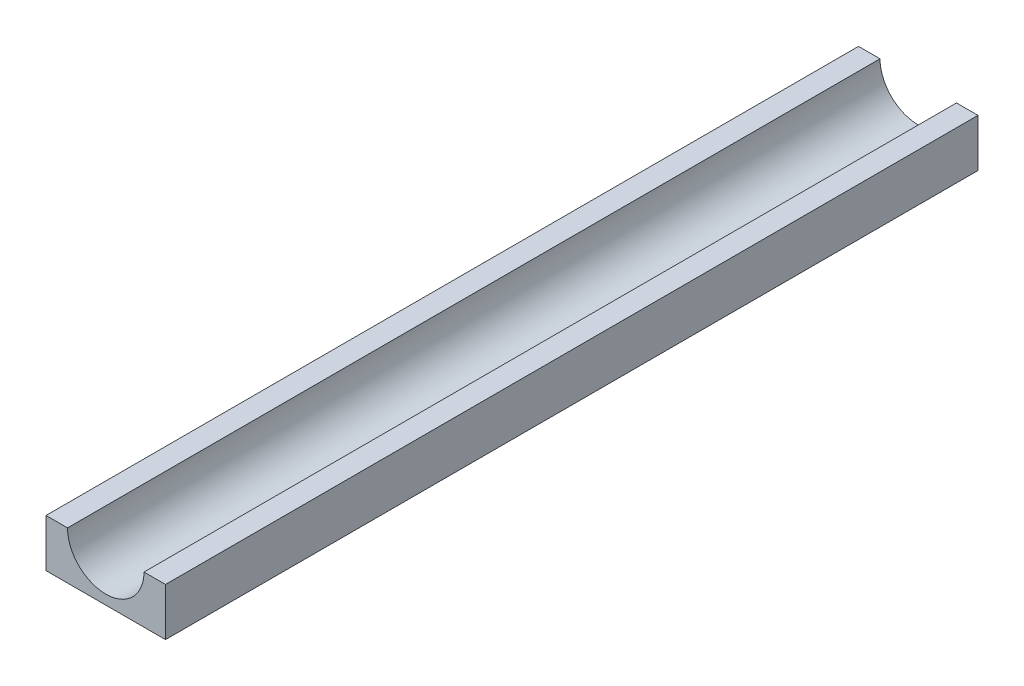
ISO-10303-21;
HEADER;
FILE_DESCRIPTION(('STEP AP214'),'2;1');
FILE_NAME('part.step','',(''),(''),'','','');
FILE_SCHEMA(('AUTOMOTIVE_DESIGN { 1 0 10303 214 1 1 1 1 }'));
ENDSEC;
DATA;
#1=APPLICATION_CONTEXT('core data for automotive mechanical design processes');
#2=APPLICATION_PROTOCOL_DEFINITION('international standard','automotive_design',2000,#1);
#3=PRODUCT_CONTEXT('',#1,'mechanical');
#4=PRODUCT('Part','Part','',(#3));
#5=PRODUCT_RELATED_PRODUCT_CATEGORY('part','',(#4));
#6=PRODUCT_DEFINITION_FORMATION('','',#4);
#7=PRODUCT_DEFINITION_CONTEXT('part definition',#1,'design');
#8=PRODUCT_DEFINITION('design','',#6,#7);
#9=PRODUCT_DEFINITION_SHAPE('','',#8);
#10=(LENGTH_UNIT() NAMED_UNIT(*) SI_UNIT(.MILLI.,.METRE.));
#11=(NAMED_UNIT(*) PLANE_ANGLE_UNIT() SI_UNIT($,.RADIAN.));
#12=(NAMED_UNIT(*) SI_UNIT($,.STERADIAN.) SOLID_ANGLE_UNIT());
#13=UNCERTAINTY_MEASURE_WITH_UNIT(LENGTH_MEASURE(1.E-05),#10,'distance_accuracy_value','');
#14=(GEOMETRIC_REPRESENTATION_CONTEXT(3) GLOBAL_UNCERTAINTY_ASSIGNED_CONTEXT((#13)) GLOBAL_UNIT_ASSIGNED_CONTEXT((#10,
#11,#12)) REPRESENTATION_CONTEXT('',''));
#15=CARTESIAN_POINT('',(0.,0.,0.));
#16=DIRECTION('',(0.,0.,1.));
#17=DIRECTION('',(1.,0.,0.));
#18=AXIS2_PLACEMENT_3D('',#15,#16,#17);
#19=CARTESIAN_POINT('',(12.5,5.,170.));
#20=DIRECTION('',(0.,-1.,0.));
#21=DIRECTION('',(1.,0.,0.));
#22=AXIS2_PLACEMENT_3D('',#19,#20,#21);
#23=PLANE('',#22);
#24=DIRECTION('',(-1.,0.,0.));
#25=VECTOR('',#24,1.);
#26=CARTESIAN_POINT('',(12.5,5.,170.));
#27=LINE('',#26,#25);
#28=CARTESIAN_POINT('',(-8.,5.,170.));
#29=VERTEX_POINT('',#28);
#30=CARTESIAN_POINT('',(-12.5,5.,170.));
#31=VERTEX_POINT('',#30);
#32=EDGE_CURVE('E61',#29,#31,#27,.T.);
#33=ORIENTED_EDGE('',*,*,#32,.F.);
#34=DIRECTION('',(0.,0.,-1.));
#35=VECTOR('',#34,1.);
#36=CARTESIAN_POINT('',(-8.,5.,187.888543819998));
#37=LINE('',#36,#35);
#38=CARTESIAN_POINT('',(-8.,5.,0.));
#39=VERTEX_POINT('',#38);
#40=EDGE_CURVE('E99',#29,#39,#37,.T.);
#41=ORIENTED_EDGE('',*,*,#40,.T.);
#42=DIRECTION('',(-1.,0.,0.));
#43=VECTOR('',#42,1.);
#44=CARTESIAN_POINT('',(12.5,5.,0.));
#45=LINE('',#44,#43);
#46=CARTESIAN_POINT('',(-12.5,5.,0.));
#47=VERTEX_POINT('',#46);
#48=EDGE_CURVE('E83',#39,#47,#45,.T.);
#49=ORIENTED_EDGE('',*,*,#48,.T.);
#50=DIRECTION('',(0.,0.,-1.));
#51=VECTOR('',#50,1.);
#52=CARTESIAN_POINT('',(-12.5,5.,170.));
#53=LINE('',#52,#51);
#54=EDGE_CURVE('E124',#31,#47,#53,.T.);
#55=ORIENTED_EDGE('',*,*,#54,.F.);
#56=EDGE_LOOP('',(#33,#41,#49,#55));
#57=FACE_BOUND('',#56,.T.);
#58=ADVANCED_FACE('F36',(#57),#23,.F.);
#59=CARTESIAN_POINT('',(-12.5,5.,170.));
#60=DIRECTION('',(1.,0.,0.));
#61=DIRECTION('',(0.,0.,-1.));
#62=AXIS2_PLACEMENT_3D('',#59,#60,#61);
#63=PLANE('',#62);
#64=DIRECTION('',(0.,-1.,0.));
#65=VECTOR('',#64,1.);
#66=CARTESIAN_POINT('',(-12.5,5.,0.));
#67=LINE('',#66,#65);
#68=CARTESIAN_POINT('',(-12.5,-5.,0.));
#69=VERTEX_POINT('',#68);
#70=EDGE_CURVE('E110',#47,#69,#67,.T.);
#71=ORIENTED_EDGE('',*,*,#70,.T.);
#72=DIRECTION('',(0.,0.,-1.));
#73=VECTOR('',#72,1.);
#74=CARTESIAN_POINT('',(-12.5,-5.,170.));
#75=LINE('',#74,#73);
#76=CARTESIAN_POINT('',(-12.5,-5.,170.));
#77=VERTEX_POINT('',#76);
#78=EDGE_CURVE('E11',#77,#69,#75,.T.);
#79=ORIENTED_EDGE('',*,*,#78,.F.);
#80=DIRECTION('',(0.,-1.,0.));
#81=VECTOR('',#80,1.);
#82=CARTESIAN_POINT('',(-12.5,5.,170.));
#83=LINE('',#82,#81);
#84=EDGE_CURVE('E118',#31,#77,#83,.T.);
#85=ORIENTED_EDGE('',*,*,#84,.F.);
#86=ORIENTED_EDGE('',*,*,#54,.T.);
#87=EDGE_LOOP('',(#71,#79,#85,#86));
#88=FACE_BOUND('',#87,.T.);
#89=ADVANCED_FACE('F38',(#88),#63,.F.);
#90=CARTESIAN_POINT('',(12.5,-5.,170.));
#91=DIRECTION('',(0.,1.,0.));
#92=DIRECTION('',(-1.,0.,0.));
#93=AXIS2_PLACEMENT_3D('',#90,#91,#92);
#94=PLANE('',#93);
#95=DIRECTION('',(1.,0.,0.));
#96=VECTOR('',#95,1.);
#97=CARTESIAN_POINT('',(12.5,-5.,0.));
#98=LINE('',#97,#96);
#99=CARTESIAN_POINT('',(12.5,-5.,0.));
#100=VERTEX_POINT('',#99);
#101=EDGE_CURVE('E120',#69,#100,#98,.T.);
#102=ORIENTED_EDGE('',*,*,#101,.T.);
#103=DIRECTION('',(0.,0.,-1.));
#104=VECTOR('',#103,1.);
#105=CARTESIAN_POINT('',(12.5,-5.,170.));
#106=LINE('',#105,#104);
#107=CARTESIAN_POINT('',(12.5,-5.,170.));
#108=VERTEX_POINT('',#107);
#109=EDGE_CURVE('E45',#108,#100,#106,.T.);
#110=ORIENTED_EDGE('',*,*,#109,.F.);
#111=DIRECTION('',(1.,0.,0.));
#112=VECTOR('',#111,1.);
#113=CARTESIAN_POINT('',(12.5,-5.,170.));
#114=LINE('',#113,#112);
#115=EDGE_CURVE('E90',#77,#108,#114,.T.);
#116=ORIENTED_EDGE('',*,*,#115,.F.);
#117=ORIENTED_EDGE('',*,*,#78,.T.);
#118=EDGE_LOOP('',(#102,#110,#116,#117));
#119=FACE_BOUND('',#118,.T.);
#120=ADVANCED_FACE('F153',(#119),#94,.F.);
#121=CARTESIAN_POINT('',(12.5,5.,170.));
#122=DIRECTION('',(-1.,0.,0.));
#123=DIRECTION('',(0.,-1.,0.));
#124=AXIS2_PLACEMENT_3D('',#121,#122,#123);
#125=PLANE('',#124);
#126=DIRECTION('',(0.,1.,0.));
#127=VECTOR('',#126,1.);
#128=CARTESIAN_POINT('',(12.5,5.,0.));
#129=LINE('',#128,#127);
#130=CARTESIAN_POINT('',(12.5,5.,0.));
#131=VERTEX_POINT('',#130);
#132=EDGE_CURVE('E113',#100,#131,#129,.T.);
#133=ORIENTED_EDGE('',*,*,#132,.T.);
#134=DIRECTION('',(0.,0.,-1.));
#135=VECTOR('',#134,1.);
#136=CARTESIAN_POINT('',(12.5,5.,170.));
#137=LINE('',#136,#135);
#138=CARTESIAN_POINT('',(12.5,5.,170.));
#139=VERTEX_POINT('',#138);
#140=EDGE_CURVE('E127',#139,#131,#137,.T.);
#141=ORIENTED_EDGE('',*,*,#140,.F.);
#142=DIRECTION('',(0.,1.,0.));
#143=VECTOR('',#142,1.);
#144=CARTESIAN_POINT('',(12.5,5.,170.));
#145=LINE('',#144,#143);
#146=EDGE_CURVE('E139',#108,#139,#145,.T.);
#147=ORIENTED_EDGE('',*,*,#146,.F.);
#148=ORIENTED_EDGE('',*,*,#109,.T.);
#149=EDGE_LOOP('',(#133,#141,#147,#148));
#150=FACE_BOUND('',#149,.T.);
#151=ADVANCED_FACE('F137',(#150),#125,.F.);
#152=CARTESIAN_POINT('',(8.,5.,0.));
#153=VERTEX_POINT('',#152);
#154=EDGE_CURVE('E112',#131,#153,#45,.T.);
#155=ORIENTED_EDGE('',*,*,#154,.T.);
#156=DIRECTION('',(0.,0.,-1.));
#157=VECTOR('',#156,1.);
#158=CARTESIAN_POINT('',(8.,5.,187.888543819998));
#159=LINE('',#158,#157);
#160=CARTESIAN_POINT('',(8.,5.,170.));
#161=VERTEX_POINT('',#160);
#162=EDGE_CURVE('E52',#161,#153,#159,.T.);
#163=ORIENTED_EDGE('',*,*,#162,.F.);
#164=EDGE_CURVE('E128',#139,#161,#27,.T.);
#165=ORIENTED_EDGE('',*,*,#164,.F.);
#166=ORIENTED_EDGE('',*,*,#140,.T.);
#167=EDGE_LOOP('',(#155,#163,#165,#166));
#168=FACE_BOUND('',#167,.T.);
#169=ADVANCED_FACE('F141',(#168),#23,.F.);
#170=CARTESIAN_POINT('',(0.,0.,170.));
#171=DIRECTION('',(0.,0.,-1.));
#172=DIRECTION('',(-1.,0.,0.));
#173=AXIS2_PLACEMENT_3D('',#170,#171,#172);
#174=PLANE('',#173);
#175=ORIENTED_EDGE('',*,*,#164,.T.);
#176=CARTESIAN_POINT('',(0.,5.,170.));
#177=DIRECTION('',(0.,0.,-1.));
#178=DIRECTION('',(-1.,0.,0.));
#179=AXIS2_PLACEMENT_3D('',#176,#177,#178);
#180=CIRCLE('',#179,8.);
#181=EDGE_CURVE('E151',#29,#161,#180,.F.);
#182=ORIENTED_EDGE('',*,*,#181,.F.);
#183=ORIENTED_EDGE('',*,*,#32,.T.);
#184=ORIENTED_EDGE('',*,*,#84,.T.);
#185=ORIENTED_EDGE('',*,*,#115,.T.);
#186=ORIENTED_EDGE('',*,*,#146,.T.);
#187=EDGE_LOOP('',(#175,#182,#183,#184,#185,#186));
#188=FACE_BOUND('',#187,.T.);
#189=ADVANCED_FACE('F162',(#188),#174,.F.);
#190=CARTESIAN_POINT('',(0.,0.,0.));
#191=DIRECTION('',(0.,0.,-1.));
#192=DIRECTION('',(-1.,0.,0.));
#193=AXIS2_PLACEMENT_3D('',#190,#191,#192);
#194=PLANE('',#193);
#195=CARTESIAN_POINT('',(0.,5.,0.));
#196=DIRECTION('',(0.,0.,-1.));
#197=DIRECTION('',(1.,0.,0.));
#198=AXIS2_PLACEMENT_3D('',#195,#196,#197);
#199=CIRCLE('',#198,8.);
#200=EDGE_CURVE('E97',#153,#39,#199,.T.);
#201=ORIENTED_EDGE('',*,*,#200,.F.);
#202=ORIENTED_EDGE('',*,*,#154,.F.);
#203=ORIENTED_EDGE('',*,*,#132,.F.);
#204=ORIENTED_EDGE('',*,*,#101,.F.);
#205=ORIENTED_EDGE('',*,*,#70,.F.);
#206=ORIENTED_EDGE('',*,*,#48,.F.);
#207=EDGE_LOOP('',(#201,#202,#203,#204,#205,#206));
#208=FACE_BOUND('',#207,.T.);
#209=ADVANCED_FACE('F108',(#208),#194,.T.);
#210=CARTESIAN_POINT('',(0.,5.,187.888543819998));
#211=DIRECTION('',(0.,0.,-1.));
#212=DIRECTION('',(-1.,0.,0.));
#213=AXIS2_PLACEMENT_3D('',#210,#211,#212);
#214=CYLINDRICAL_SURFACE('',#213,8.);
#215=ORIENTED_EDGE('',*,*,#181,.T.);
#216=ORIENTED_EDGE('',*,*,#162,.T.);
#217=ORIENTED_EDGE('',*,*,#200,.T.);
#218=ORIENTED_EDGE('',*,*,#40,.F.);
#219=EDGE_LOOP('',(#215,#216,#217,#218));
#220=FACE_BOUND('',#219,.T.);
#221=ADVANCED_FACE('F98',(#220),#214,.F.);
#222=CLOSED_SHELL('',(#58,#89,#120,#151,#169,#189,#209,#221));
#223=MANIFOLD_SOLID_BREP('B2',#222);
#224=ADVANCED_BREP_SHAPE_REPRESENTATION('',(#18,#223),#14);
#225=SHAPE_DEFINITION_REPRESENTATION(#9,#224);
ENDSEC;
END-ISO-10303-21;
